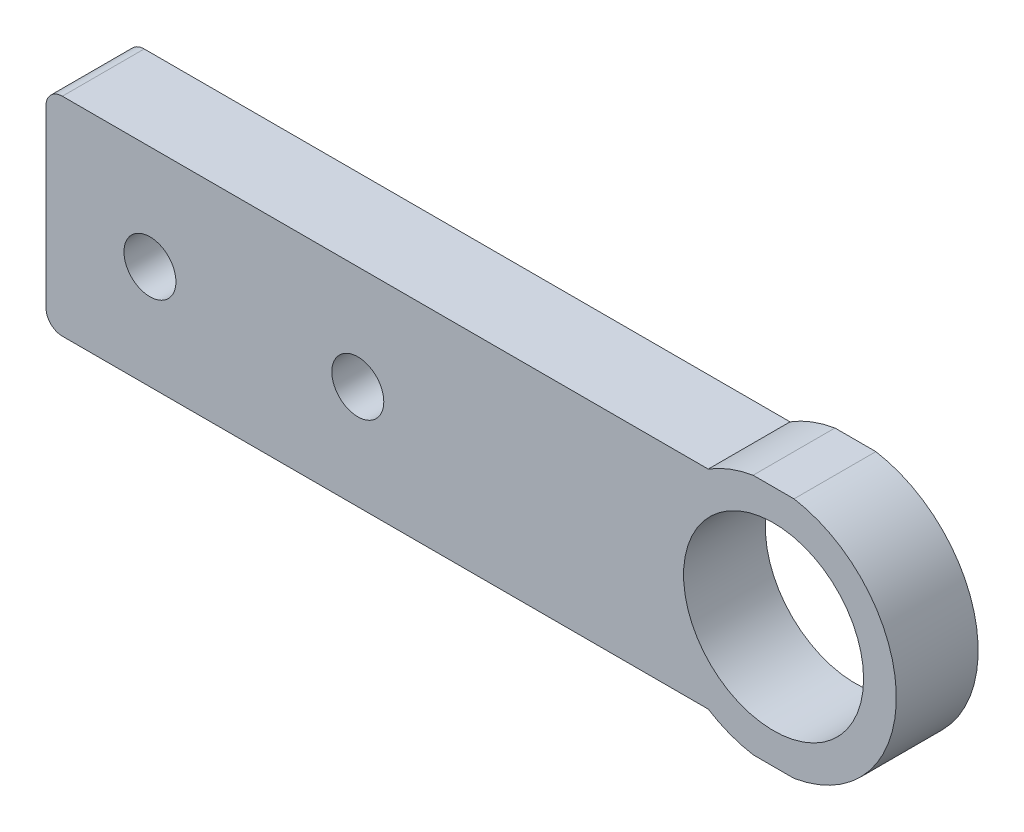
ISO-10303-21;
HEADER;
FILE_DESCRIPTION(('STEP AP214'),'2;1');
FILE_NAME('part.step','',(''),(''),'','','');
FILE_SCHEMA(('AUTOMOTIVE_DESIGN { 1 0 10303 214 1 1 1 1 }'));
ENDSEC;
DATA;
#1=APPLICATION_CONTEXT('core data for automotive mechanical design processes');
#2=APPLICATION_PROTOCOL_DEFINITION('international standard','automotive_design',2000,#1);
#3=PRODUCT_CONTEXT('',#1,'mechanical');
#4=PRODUCT('Part','Part','',(#3));
#5=PRODUCT_RELATED_PRODUCT_CATEGORY('part','',(#4));
#6=PRODUCT_DEFINITION_FORMATION('','',#4);
#7=PRODUCT_DEFINITION_CONTEXT('part definition',#1,'design');
#8=PRODUCT_DEFINITION('design','',#6,#7);
#9=PRODUCT_DEFINITION_SHAPE('','',#8);
#10=(LENGTH_UNIT() NAMED_UNIT(*) SI_UNIT(.MILLI.,.METRE.));
#11=(NAMED_UNIT(*) PLANE_ANGLE_UNIT() SI_UNIT($,.RADIAN.));
#12=(NAMED_UNIT(*) SI_UNIT($,.STERADIAN.) SOLID_ANGLE_UNIT());
#13=UNCERTAINTY_MEASURE_WITH_UNIT(LENGTH_MEASURE(1.E-05),#10,'distance_accuracy_value','');
#14=(GEOMETRIC_REPRESENTATION_CONTEXT(3) GLOBAL_UNCERTAINTY_ASSIGNED_CONTEXT((#13)) GLOBAL_UNIT_ASSIGNED_CONTEXT((#10,
#11,#12)) REPRESENTATION_CONTEXT('',''));
#15=CARTESIAN_POINT('',(0.,0.,0.));
#16=DIRECTION('',(0.,0.,1.));
#17=DIRECTION('',(1.,0.,0.));
#18=AXIS2_PLACEMENT_3D('',#15,#16,#17);
#19=CARTESIAN_POINT('',(44.45,0.,10.));
#20=DIRECTION('',(0.,0.,1.));
#21=DIRECTION('',(1.,0.,0.));
#22=AXIS2_PLACEMENT_3D('',#19,#20,#21);
#23=PLANE('',#22);
#24=CARTESIAN_POINT('',(44.45,0.,10.));
#25=DIRECTION('',(0.,0.,1.));
#26=DIRECTION('',(1.,0.,0.));
#27=AXIS2_PLACEMENT_3D('',#24,#25,#26);
#28=CIRCLE('',#27,11.);
#29=CARTESIAN_POINT('',(55.45,0.,10.));
#30=VERTEX_POINT('',#29);
#31=EDGE_CURVE('E213',#30,#30,#28,.T.);
#32=ORIENTED_EDGE('',*,*,#31,.F.);
#33=EDGE_LOOP('',(#32));
#34=FACE_BOUND('',#33,.T.);
#35=DIRECTION('',(0.,-1.,0.));
#36=VECTOR('',#35,1.);
#37=CARTESIAN_POINT('',(-44.45,-12.7,10.));
#38=LINE('',#37,#36);
#39=CARTESIAN_POINT('',(-44.45,10.7,10.));
#40=VERTEX_POINT('',#39);
#41=CARTESIAN_POINT('',(-44.45,-10.7,10.));
#42=VERTEX_POINT('',#41);
#43=EDGE_CURVE('E153',#40,#42,#38,.T.);
#44=ORIENTED_EDGE('',*,*,#43,.T.);
#45=CARTESIAN_POINT('',(-42.45,-10.7,10.));
#46=DIRECTION('',(0.,0.,1.));
#47=DIRECTION('',(1.,0.,0.));
#48=AXIS2_PLACEMENT_3D('',#45,#46,#47);
#49=CIRCLE('',#48,2.);
#50=CARTESIAN_POINT('',(-42.45,-12.7,10.));
#51=VERTEX_POINT('',#50);
#52=EDGE_CURVE('E41',#42,#51,#49,.T.);
#53=ORIENTED_EDGE('',*,*,#52,.T.);
#54=DIRECTION('',(1.,0.,0.));
#55=VECTOR('',#54,1.);
#56=CARTESIAN_POINT('',(36.4681455788771,-12.7,10.));
#57=LINE('',#56,#55);
#58=CARTESIAN_POINT('',(36.4681455788771,-12.7,10.));
#59=VERTEX_POINT('',#58);
#60=EDGE_CURVE('E111',#51,#59,#57,.T.);
#61=ORIENTED_EDGE('',*,*,#60,.T.);
#62=CARTESIAN_POINT('',(44.45,0.,10.));
#63=DIRECTION('',(0.,0.,1.));
#64=DIRECTION('',(-1.,0.,0.));
#65=AXIS2_PLACEMENT_3D('',#62,#63,#64);
#66=CIRCLE('',#65,15.);
#67=CARTESIAN_POINT('',(41.95,-14.790199457749,10.));
#68=VERTEX_POINT('',#67);
#69=EDGE_CURVE('E114',#59,#68,#66,.T.);
#70=ORIENTED_EDGE('',*,*,#69,.T.);
#71=DIRECTION('',(1.,0.,0.));
#72=VECTOR('',#71,1.);
#73=CARTESIAN_POINT('',(41.95,-14.790199457749,10.));
#74=LINE('',#73,#72);
#75=CARTESIAN_POINT('',(46.95,-14.790199457749,10.));
#76=VERTEX_POINT('',#75);
#77=EDGE_CURVE('E130',#68,#76,#74,.T.);
#78=ORIENTED_EDGE('',*,*,#77,.T.);
#79=CARTESIAN_POINT('',(44.45,0.,10.));
#80=DIRECTION('',(0.,0.,1.));
#81=DIRECTION('',(1.,0.,0.));
#82=AXIS2_PLACEMENT_3D('',#79,#80,#81);
#83=CIRCLE('',#82,15.);
#84=CARTESIAN_POINT('',(46.95,14.790199457749,10.));
#85=VERTEX_POINT('',#84);
#86=EDGE_CURVE('E191',#76,#85,#83,.T.);
#87=ORIENTED_EDGE('',*,*,#86,.T.);
#88=DIRECTION('',(-1.,0.,0.));
#89=VECTOR('',#88,1.);
#90=CARTESIAN_POINT('',(41.95,14.790199457749,10.));
#91=LINE('',#90,#89);
#92=CARTESIAN_POINT('',(41.95,14.7901994577491,10.));
#93=VERTEX_POINT('',#92);
#94=EDGE_CURVE('E206',#85,#93,#91,.T.);
#95=ORIENTED_EDGE('',*,*,#94,.T.);
#96=CARTESIAN_POINT('',(44.45,0.,10.));
#97=DIRECTION('',(0.,0.,1.));
#98=DIRECTION('',(1.,0.,0.));
#99=AXIS2_PLACEMENT_3D('',#96,#97,#98);
#100=CIRCLE('',#99,15.);
#101=CARTESIAN_POINT('',(36.4681455788771,12.7,10.));
#102=VERTEX_POINT('',#101);
#103=EDGE_CURVE('E204',#93,#102,#100,.T.);
#104=ORIENTED_EDGE('',*,*,#103,.T.);
#105=DIRECTION('',(-1.,0.,0.));
#106=VECTOR('',#105,1.);
#107=CARTESIAN_POINT('',(36.4681455788771,12.7,10.));
#108=LINE('',#107,#106);
#109=CARTESIAN_POINT('',(-42.45,12.7,10.));
#110=VERTEX_POINT('',#109);
#111=EDGE_CURVE('E154',#102,#110,#108,.T.);
#112=ORIENTED_EDGE('',*,*,#111,.T.);
#113=CARTESIAN_POINT('',(-42.45,10.7,10.));
#114=DIRECTION('',(0.,0.,1.));
#115=DIRECTION('',(1.,0.,0.));
#116=AXIS2_PLACEMENT_3D('',#113,#114,#115);
#117=CIRCLE('',#116,2.);
#118=EDGE_CURVE('E151',#110,#40,#117,.T.);
#119=ORIENTED_EDGE('',*,*,#118,.T.);
#120=EDGE_LOOP('',(#44,#53,#61,#70,#78,#87,#95,#104,#112,#119));
#121=FACE_BOUND('',#120,.T.);
#122=CARTESIAN_POINT('',(-31.75,0.,10.));
#123=DIRECTION('',(0.,0.,1.));
#124=DIRECTION('',(1.,0.,0.));
#125=AXIS2_PLACEMENT_3D('',#122,#123,#124);
#126=CIRCLE('',#125,3.175);
#127=CARTESIAN_POINT('',(-28.575,0.,10.));
#128=VERTEX_POINT('',#127);
#129=EDGE_CURVE('E201',#128,#128,#126,.T.);
#130=ORIENTED_EDGE('',*,*,#129,.F.);
#131=EDGE_LOOP('',(#130));
#132=FACE_BOUND('',#131,.T.);
#133=CARTESIAN_POINT('',(-6.34999999999997,0.,10.));
#134=DIRECTION('',(0.,0.,1.));
#135=DIRECTION('',(1.,0.,0.));
#136=AXIS2_PLACEMENT_3D('',#133,#134,#135);
#137=CIRCLE('',#136,3.175);
#138=CARTESIAN_POINT('',(-3.17499999999998,0.,10.));
#139=VERTEX_POINT('',#138);
#140=EDGE_CURVE('E219',#139,#139,#137,.T.);
#141=ORIENTED_EDGE('',*,*,#140,.F.);
#142=EDGE_LOOP('',(#141));
#143=FACE_BOUND('',#142,.T.);
#144=ADVANCED_FACE('F33',(#34,#121,#132,#143),#23,.T.);
#145=CARTESIAN_POINT('',(44.45,0.,0.));
#146=DIRECTION('',(0.,0.,1.));
#147=DIRECTION('',(1.,0.,0.));
#148=AXIS2_PLACEMENT_3D('',#145,#146,#147);
#149=PLANE('',#148);
#150=DIRECTION('',(1.,0.,0.));
#151=VECTOR('',#150,1.);
#152=CARTESIAN_POINT('',(36.4681455788771,-12.7,0.));
#153=LINE('',#152,#151);
#154=CARTESIAN_POINT('',(-42.45,-12.7,0.));
#155=VERTEX_POINT('',#154);
#156=CARTESIAN_POINT('',(36.4681455788771,-12.7,0.));
#157=VERTEX_POINT('',#156);
#158=EDGE_CURVE('E134',#155,#157,#153,.T.);
#159=ORIENTED_EDGE('',*,*,#158,.F.);
#160=CARTESIAN_POINT('',(-42.45,-10.7,0.));
#161=DIRECTION('',(0.,0.,1.));
#162=DIRECTION('',(1.,0.,0.));
#163=AXIS2_PLACEMENT_3D('',#160,#161,#162);
#164=CIRCLE('',#163,2.);
#165=CARTESIAN_POINT('',(-44.45,-10.7,0.));
#166=VERTEX_POINT('',#165);
#167=EDGE_CURVE('E145',#155,#166,#164,.F.);
#168=ORIENTED_EDGE('',*,*,#167,.T.);
#169=DIRECTION('',(0.,-1.,0.));
#170=VECTOR('',#169,1.);
#171=CARTESIAN_POINT('',(-44.45,-12.7,0.));
#172=LINE('',#171,#170);
#173=CARTESIAN_POINT('',(-44.45,10.7,0.));
#174=VERTEX_POINT('',#173);
#175=EDGE_CURVE('E121',#174,#166,#172,.T.);
#176=ORIENTED_EDGE('',*,*,#175,.F.);
#177=CARTESIAN_POINT('',(-42.45,10.7,0.));
#178=DIRECTION('',(0.,0.,1.));
#179=DIRECTION('',(1.,0.,0.));
#180=AXIS2_PLACEMENT_3D('',#177,#178,#179);
#181=CIRCLE('',#180,2.);
#182=CARTESIAN_POINT('',(-42.45,12.7,0.));
#183=VERTEX_POINT('',#182);
#184=EDGE_CURVE('E138',#174,#183,#181,.F.);
#185=ORIENTED_EDGE('',*,*,#184,.T.);
#186=DIRECTION('',(-1.,0.,0.));
#187=VECTOR('',#186,1.);
#188=CARTESIAN_POINT('',(36.4681455788771,12.7,0.));
#189=LINE('',#188,#187);
#190=CARTESIAN_POINT('',(36.4681455788771,12.7,0.));
#191=VERTEX_POINT('',#190);
#192=EDGE_CURVE('E166',#191,#183,#189,.T.);
#193=ORIENTED_EDGE('',*,*,#192,.F.);
#194=CARTESIAN_POINT('',(44.45,0.,0.));
#195=DIRECTION('',(0.,0.,1.));
#196=DIRECTION('',(1.,0.,0.));
#197=AXIS2_PLACEMENT_3D('',#194,#195,#196);
#198=CIRCLE('',#197,15.);
#199=CARTESIAN_POINT('',(41.95,14.7901994577491,0.));
#200=VERTEX_POINT('',#199);
#201=EDGE_CURVE('E170',#200,#191,#198,.T.);
#202=ORIENTED_EDGE('',*,*,#201,.F.);
#203=DIRECTION('',(-1.,0.,0.));
#204=VECTOR('',#203,1.);
#205=CARTESIAN_POINT('',(41.95,14.790199457749,0.));
#206=LINE('',#205,#204);
#207=CARTESIAN_POINT('',(46.95,14.790199457749,0.));
#208=VERTEX_POINT('',#207);
#209=EDGE_CURVE('E173',#208,#200,#206,.T.);
#210=ORIENTED_EDGE('',*,*,#209,.F.);
#211=CARTESIAN_POINT('',(44.45,0.,0.));
#212=DIRECTION('',(0.,0.,1.));
#213=DIRECTION('',(1.,0.,0.));
#214=AXIS2_PLACEMENT_3D('',#211,#212,#213);
#215=CIRCLE('',#214,15.);
#216=CARTESIAN_POINT('',(46.95,-14.790199457749,0.));
#217=VERTEX_POINT('',#216);
#218=EDGE_CURVE('E190',#217,#208,#215,.T.);
#219=ORIENTED_EDGE('',*,*,#218,.F.);
#220=DIRECTION('',(1.,0.,0.));
#221=VECTOR('',#220,1.);
#222=CARTESIAN_POINT('',(41.95,-14.790199457749,0.));
#223=LINE('',#222,#221);
#224=CARTESIAN_POINT('',(41.95,-14.790199457749,0.));
#225=VERTEX_POINT('',#224);
#226=EDGE_CURVE('E195',#225,#217,#223,.T.);
#227=ORIENTED_EDGE('',*,*,#226,.F.);
#228=CARTESIAN_POINT('',(44.45,0.,0.));
#229=DIRECTION('',(0.,0.,1.));
#230=DIRECTION('',(-1.,0.,0.));
#231=AXIS2_PLACEMENT_3D('',#228,#229,#230);
#232=CIRCLE('',#231,15.);
#233=EDGE_CURVE('E197',#157,#225,#232,.T.);
#234=ORIENTED_EDGE('',*,*,#233,.F.);
#235=EDGE_LOOP('',(#159,#168,#176,#185,#193,#202,#210,#219,#227,#234));
#236=FACE_BOUND('',#235,.T.);
#237=CARTESIAN_POINT('',(-31.75,0.,0.));
#238=DIRECTION('',(0.,0.,1.));
#239=DIRECTION('',(1.,0.,0.));
#240=AXIS2_PLACEMENT_3D('',#237,#238,#239);
#241=CIRCLE('',#240,3.175);
#242=CARTESIAN_POINT('',(-28.575,0.,0.));
#243=VERTEX_POINT('',#242);
#244=EDGE_CURVE('E210',#243,#243,#241,.T.);
#245=ORIENTED_EDGE('',*,*,#244,.T.);
#246=EDGE_LOOP('',(#245));
#247=FACE_BOUND('',#246,.T.);
#248=CARTESIAN_POINT('',(44.45,0.,0.));
#249=DIRECTION('',(0.,0.,1.));
#250=DIRECTION('',(1.,0.,0.));
#251=AXIS2_PLACEMENT_3D('',#248,#249,#250);
#252=CIRCLE('',#251,11.);
#253=CARTESIAN_POINT('',(55.45,0.,0.));
#254=VERTEX_POINT('',#253);
#255=EDGE_CURVE('E216',#254,#254,#252,.T.);
#256=ORIENTED_EDGE('',*,*,#255,.T.);
#257=EDGE_LOOP('',(#256));
#258=FACE_BOUND('',#257,.T.);
#259=CARTESIAN_POINT('',(-6.34999999999997,0.,0.));
#260=DIRECTION('',(0.,0.,1.));
#261=DIRECTION('',(1.,0.,0.));
#262=AXIS2_PLACEMENT_3D('',#259,#260,#261);
#263=CIRCLE('',#262,3.175);
#264=CARTESIAN_POINT('',(-3.17499999999998,0.,0.));
#265=VERTEX_POINT('',#264);
#266=EDGE_CURVE('E222',#265,#265,#263,.T.);
#267=ORIENTED_EDGE('',*,*,#266,.T.);
#268=EDGE_LOOP('',(#267));
#269=FACE_BOUND('',#268,.T.);
#270=ADVANCED_FACE('F163',(#236,#247,#258,#269),#149,.F.);
#271=CARTESIAN_POINT('',(36.4681455788771,-12.7,10.));
#272=DIRECTION('',(0.,1.,0.));
#273=DIRECTION('',(-1.,0.,0.));
#274=AXIS2_PLACEMENT_3D('',#271,#272,#273);
#275=PLANE('',#274);
#276=ORIENTED_EDGE('',*,*,#60,.F.);
#277=DIRECTION('',(0.,0.,-1.));
#278=VECTOR('',#277,1.);
#279=CARTESIAN_POINT('',(-42.45,-12.7,10.));
#280=LINE('',#279,#278);
#281=EDGE_CURVE('E136',#51,#155,#280,.T.);
#282=ORIENTED_EDGE('',*,*,#281,.T.);
#283=ORIENTED_EDGE('',*,*,#158,.T.);
#284=DIRECTION('',(0.,0.,-1.));
#285=VECTOR('',#284,1.);
#286=CARTESIAN_POINT('',(36.4681455788771,-12.7,10.));
#287=LINE('',#286,#285);
#288=EDGE_CURVE('E126',#59,#157,#287,.T.);
#289=ORIENTED_EDGE('',*,*,#288,.F.);
#290=EDGE_LOOP('',(#276,#282,#283,#289));
#291=FACE_BOUND('',#290,.T.);
#292=ADVANCED_FACE('F132',(#291),#275,.F.);
#293=CARTESIAN_POINT('',(44.45,0.,10.));
#294=DIRECTION('',(0.,0.,-1.));
#295=DIRECTION('',(-1.,0.,0.));
#296=AXIS2_PLACEMENT_3D('',#293,#294,#295);
#297=CYLINDRICAL_SURFACE('',#296,15.);
#298=ORIENTED_EDGE('',*,*,#233,.T.);
#299=DIRECTION('',(0.,0.,-1.));
#300=VECTOR('',#299,1.);
#301=CARTESIAN_POINT('',(41.95,-14.790199457749,10.));
#302=LINE('',#301,#300);
#303=EDGE_CURVE('E128',#68,#225,#302,.T.);
#304=ORIENTED_EDGE('',*,*,#303,.F.);
#305=ORIENTED_EDGE('',*,*,#69,.F.);
#306=ORIENTED_EDGE('',*,*,#288,.T.);
#307=EDGE_LOOP('',(#298,#304,#305,#306));
#308=FACE_BOUND('',#307,.T.);
#309=ADVANCED_FACE('F125',(#308),#297,.T.);
#310=CARTESIAN_POINT('',(41.95,-14.790199457749,10.));
#311=DIRECTION('',(0.,1.,0.));
#312=DIRECTION('',(0.,0.,1.));
#313=AXIS2_PLACEMENT_3D('',#310,#311,#312);
#314=PLANE('',#313);
#315=ORIENTED_EDGE('',*,*,#226,.T.);
#316=DIRECTION('',(0.,0.,-1.));
#317=VECTOR('',#316,1.);
#318=CARTESIAN_POINT('',(46.95,-14.790199457749,10.));
#319=LINE('',#318,#317);
#320=EDGE_CURVE('E140',#76,#217,#319,.T.);
#321=ORIENTED_EDGE('',*,*,#320,.F.);
#322=ORIENTED_EDGE('',*,*,#77,.F.);
#323=ORIENTED_EDGE('',*,*,#303,.T.);
#324=EDGE_LOOP('',(#315,#321,#322,#323));
#325=FACE_BOUND('',#324,.T.);
#326=ADVANCED_FACE('F257',(#325),#314,.F.);
#327=CARTESIAN_POINT('',(44.45,0.,10.));
#328=DIRECTION('',(0.,0.,-1.));
#329=DIRECTION('',(-1.,0.,0.));
#330=AXIS2_PLACEMENT_3D('',#327,#328,#329);
#331=CYLINDRICAL_SURFACE('',#330,15.);
#332=ORIENTED_EDGE('',*,*,#218,.T.);
#333=DIRECTION('',(0.,0.,-1.));
#334=VECTOR('',#333,1.);
#335=CARTESIAN_POINT('',(46.95,14.790199457749,10.));
#336=LINE('',#335,#334);
#337=EDGE_CURVE('E181',#85,#208,#336,.T.);
#338=ORIENTED_EDGE('',*,*,#337,.F.);
#339=ORIENTED_EDGE('',*,*,#86,.F.);
#340=ORIENTED_EDGE('',*,*,#320,.T.);
#341=EDGE_LOOP('',(#332,#338,#339,#340));
#342=FACE_BOUND('',#341,.T.);
#343=ADVANCED_FACE('F188',(#342),#331,.T.);
#344=CARTESIAN_POINT('',(41.95,14.790199457749,10.));
#345=DIRECTION('',(0.,-1.,0.));
#346=DIRECTION('',(0.,0.,-1.));
#347=AXIS2_PLACEMENT_3D('',#344,#345,#346);
#348=PLANE('',#347);
#349=ORIENTED_EDGE('',*,*,#209,.T.);
#350=DIRECTION('',(0.,0.,-1.));
#351=VECTOR('',#350,1.);
#352=CARTESIAN_POINT('',(41.95,14.7901994577491,10.));
#353=LINE('',#352,#351);
#354=EDGE_CURVE('E178',#93,#200,#353,.T.);
#355=ORIENTED_EDGE('',*,*,#354,.F.);
#356=ORIENTED_EDGE('',*,*,#94,.F.);
#357=ORIENTED_EDGE('',*,*,#337,.T.);
#358=EDGE_LOOP('',(#349,#355,#356,#357));
#359=FACE_BOUND('',#358,.T.);
#360=ADVANCED_FACE('F250',(#359),#348,.F.);
#361=CARTESIAN_POINT('',(44.45,0.,10.));
#362=DIRECTION('',(0.,0.,-1.));
#363=DIRECTION('',(-1.,0.,0.));
#364=AXIS2_PLACEMENT_3D('',#361,#362,#363);
#365=CYLINDRICAL_SURFACE('',#364,15.);
#366=ORIENTED_EDGE('',*,*,#201,.T.);
#367=DIRECTION('',(0.,0.,-1.));
#368=VECTOR('',#367,1.);
#369=CARTESIAN_POINT('',(36.4681455788771,12.7,10.));
#370=LINE('',#369,#368);
#371=EDGE_CURVE('E159',#102,#191,#370,.T.);
#372=ORIENTED_EDGE('',*,*,#371,.F.);
#373=ORIENTED_EDGE('',*,*,#103,.F.);
#374=ORIENTED_EDGE('',*,*,#354,.T.);
#375=EDGE_LOOP('',(#366,#372,#373,#374));
#376=FACE_BOUND('',#375,.T.);
#377=ADVANCED_FACE('F247',(#376),#365,.T.);
#378=CARTESIAN_POINT('',(36.4681455788771,12.7,10.));
#379=DIRECTION('',(0.,-1.,0.));
#380=DIRECTION('',(1.,0.,0.));
#381=AXIS2_PLACEMENT_3D('',#378,#379,#380);
#382=PLANE('',#381);
#383=ORIENTED_EDGE('',*,*,#192,.T.);
#384=DIRECTION('',(0.,0.,-1.));
#385=VECTOR('',#384,1.);
#386=CARTESIAN_POINT('',(-42.45,12.7,10.));
#387=LINE('',#386,#385);
#388=EDGE_CURVE('E11',#183,#110,#387,.F.);
#389=ORIENTED_EDGE('',*,*,#388,.T.);
#390=ORIENTED_EDGE('',*,*,#111,.F.);
#391=ORIENTED_EDGE('',*,*,#371,.T.);
#392=EDGE_LOOP('',(#383,#389,#390,#391));
#393=FACE_BOUND('',#392,.T.);
#394=ADVANCED_FACE('F168',(#393),#382,.F.);
#395=CARTESIAN_POINT('',(-44.45,-12.7,10.));
#396=DIRECTION('',(1.,0.,0.));
#397=DIRECTION('',(0.,0.,-1.));
#398=AXIS2_PLACEMENT_3D('',#395,#396,#397);
#399=PLANE('',#398);
#400=ORIENTED_EDGE('',*,*,#175,.T.);
#401=DIRECTION('',(0.,0.,-1.));
#402=VECTOR('',#401,1.);
#403=CARTESIAN_POINT('',(-44.45,-10.7,10.));
#404=LINE('',#403,#402);
#405=EDGE_CURVE('E54',#166,#42,#404,.F.);
#406=ORIENTED_EDGE('',*,*,#405,.T.);
#407=ORIENTED_EDGE('',*,*,#43,.F.);
#408=DIRECTION('',(0.,0.,-1.));
#409=VECTOR('',#408,1.);
#410=CARTESIAN_POINT('',(-44.45,10.7,10.));
#411=LINE('',#410,#409);
#412=EDGE_CURVE('E147',#40,#174,#411,.T.);
#413=ORIENTED_EDGE('',*,*,#412,.T.);
#414=EDGE_LOOP('',(#400,#406,#407,#413));
#415=FACE_BOUND('',#414,.T.);
#416=ADVANCED_FACE('F157',(#415),#399,.F.);
#417=CARTESIAN_POINT('',(-31.75,0.,10.));
#418=DIRECTION('',(0.,0.,-1.));
#419=DIRECTION('',(-1.,0.,0.));
#420=AXIS2_PLACEMENT_3D('',#417,#418,#419);
#421=CYLINDRICAL_SURFACE('',#420,3.175);
#422=ORIENTED_EDGE('',*,*,#129,.T.);
#423=EDGE_LOOP('',(#422));
#424=FACE_BOUND('',#423,.T.);
#425=ORIENTED_EDGE('',*,*,#244,.F.);
#426=EDGE_LOOP('',(#425));
#427=FACE_BOUND('',#426,.T.);
#428=ADVANCED_FACE('F240',(#424,#427),#421,.F.);
#429=CARTESIAN_POINT('',(44.45,0.,10.));
#430=DIRECTION('',(0.,0.,-1.));
#431=DIRECTION('',(-1.,0.,0.));
#432=AXIS2_PLACEMENT_3D('',#429,#430,#431);
#433=CYLINDRICAL_SURFACE('',#432,11.);
#434=ORIENTED_EDGE('',*,*,#31,.T.);
#435=EDGE_LOOP('',(#434));
#436=FACE_BOUND('',#435,.T.);
#437=ORIENTED_EDGE('',*,*,#255,.F.);
#438=EDGE_LOOP('',(#437));
#439=FACE_BOUND('',#438,.T.);
#440=ADVANCED_FACE('F270',(#436,#439),#433,.F.);
#441=CARTESIAN_POINT('',(-6.34999999999997,0.,10.));
#442=DIRECTION('',(0.,0.,-1.));
#443=DIRECTION('',(-1.,0.,0.));
#444=AXIS2_PLACEMENT_3D('',#441,#442,#443);
#445=CYLINDRICAL_SURFACE('',#444,3.175);
#446=ORIENTED_EDGE('',*,*,#140,.T.);
#447=EDGE_LOOP('',(#446));
#448=FACE_BOUND('',#447,.T.);
#449=ORIENTED_EDGE('',*,*,#266,.F.);
#450=EDGE_LOOP('',(#449));
#451=FACE_BOUND('',#450,.T.);
#452=ADVANCED_FACE('F228',(#448,#451),#445,.F.);
#453=CARTESIAN_POINT('',(-42.45,-10.7,10.));
#454=DIRECTION('',(0.,0.,-1.));
#455=DIRECTION('',(-1.,0.,0.));
#456=AXIS2_PLACEMENT_3D('',#453,#454,#455);
#457=CYLINDRICAL_SURFACE('',#456,2.);
#458=ORIENTED_EDGE('',*,*,#52,.F.);
#459=ORIENTED_EDGE('',*,*,#405,.F.);
#460=ORIENTED_EDGE('',*,*,#167,.F.);
#461=ORIENTED_EDGE('',*,*,#281,.F.);
#462=EDGE_LOOP('',(#458,#459,#460,#461));
#463=FACE_BOUND('',#462,.T.);
#464=ADVANCED_FACE('F263',(#463),#457,.T.);
#465=CARTESIAN_POINT('',(-42.45,10.7,10.));
#466=DIRECTION('',(0.,0.,-1.));
#467=DIRECTION('',(-1.,0.,0.));
#468=AXIS2_PLACEMENT_3D('',#465,#466,#467);
#469=CYLINDRICAL_SURFACE('',#468,2.);
#470=ORIENTED_EDGE('',*,*,#118,.F.);
#471=ORIENTED_EDGE('',*,*,#388,.F.);
#472=ORIENTED_EDGE('',*,*,#184,.F.);
#473=ORIENTED_EDGE('',*,*,#412,.F.);
#474=EDGE_LOOP('',(#470,#471,#472,#473));
#475=FACE_BOUND('',#474,.T.);
#476=ADVANCED_FACE('F35',(#475),#469,.T.);
#477=CLOSED_SHELL('',(#144,#270,#292,#309,#326,#343,#360,#377,#394,#416,#428,#440,#452,#464,#476));
#478=MANIFOLD_SOLID_BREP('B2',#477);
#479=ADVANCED_BREP_SHAPE_REPRESENTATION('',(#18,#478),#14);
#480=SHAPE_DEFINITION_REPRESENTATION(#9,#479);
ENDSEC;
END-ISO-10303-21;
